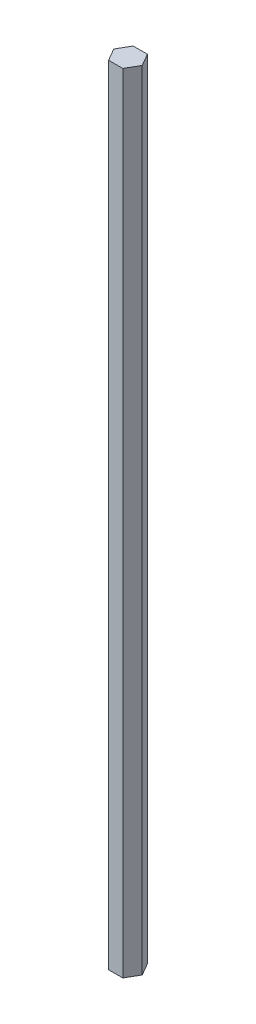
ISO-10303-21;
HEADER;
FILE_DESCRIPTION(('STEP AP214'),'2;1');
FILE_NAME('part.step','',(''),(''),'','','');
FILE_SCHEMA(('AUTOMOTIVE_DESIGN { 1 0 10303 214 1 1 1 1 }'));
ENDSEC;
DATA;
#1=APPLICATION_CONTEXT('core data for automotive mechanical design processes');
#2=APPLICATION_PROTOCOL_DEFINITION('international standard','automotive_design',2000,#1);
#3=PRODUCT_CONTEXT('',#1,'mechanical');
#4=PRODUCT('Part','Part','',(#3));
#5=PRODUCT_RELATED_PRODUCT_CATEGORY('part','',(#4));
#6=PRODUCT_DEFINITION_FORMATION('','',#4);
#7=PRODUCT_DEFINITION_CONTEXT('part definition',#1,'design');
#8=PRODUCT_DEFINITION('design','',#6,#7);
#9=PRODUCT_DEFINITION_SHAPE('','',#8);
#10=(LENGTH_UNIT() NAMED_UNIT(*) SI_UNIT(.MILLI.,.METRE.));
#11=(NAMED_UNIT(*) PLANE_ANGLE_UNIT() SI_UNIT($,.RADIAN.));
#12=(NAMED_UNIT(*) SI_UNIT($,.STERADIAN.) SOLID_ANGLE_UNIT());
#13=UNCERTAINTY_MEASURE_WITH_UNIT(LENGTH_MEASURE(1.E-05),#10,'distance_accuracy_value','');
#14=(GEOMETRIC_REPRESENTATION_CONTEXT(3) GLOBAL_UNCERTAINTY_ASSIGNED_CONTEXT((#13)) GLOBAL_UNIT_ASSIGNED_CONTEXT((#10,
#11,#12)) REPRESENTATION_CONTEXT('',''));
#15=CARTESIAN_POINT('',(0.,0.,0.));
#16=DIRECTION('',(0.,0.,1.));
#17=DIRECTION('',(1.,0.,0.));
#18=AXIS2_PLACEMENT_3D('',#15,#16,#17);
#19=CARTESIAN_POINT('',(3.6661742093542,406.4,6.34999999999996));
#20=DIRECTION('',(-0.866025403784442,0.,-0.499999999999995));
#21=DIRECTION('',(-0.499999999999995,0.,0.866025403784442));
#22=AXIS2_PLACEMENT_3D('',#19,#20,#21);
#23=PLANE('',#22);
#24=DIRECTION('',(0.499999999999995,0.,-0.866025403784442));
#25=VECTOR('',#24,1.);
#26=CARTESIAN_POINT('',(3.6661742093542,0.,6.34999999999996));
#27=LINE('',#26,#25);
#28=CARTESIAN_POINT('',(3.6661742093542,0.,6.34999999999996));
#29=VERTEX_POINT('',#28);
#30=CARTESIAN_POINT('',(7.33234841870825,0.,0.));
#31=VERTEX_POINT('',#30);
#32=EDGE_CURVE('E128',#29,#31,#27,.T.);
#33=ORIENTED_EDGE('',*,*,#32,.T.);
#34=DIRECTION('',(0.,-1.,0.));
#35=VECTOR('',#34,1.);
#36=CARTESIAN_POINT('',(7.33234841870825,406.4,0.));
#37=LINE('',#36,#35);
#38=CARTESIAN_POINT('',(7.33234841870825,406.4,0.));
#39=VERTEX_POINT('',#38);
#40=EDGE_CURVE('E11',#39,#31,#37,.T.);
#41=ORIENTED_EDGE('',*,*,#40,.F.);
#42=DIRECTION('',(0.499999999999995,0.,-0.866025403784442));
#43=VECTOR('',#42,1.);
#44=CARTESIAN_POINT('',(3.6661742093542,406.4,6.34999999999996));
#45=LINE('',#44,#43);
#46=CARTESIAN_POINT('',(3.6661742093542,406.4,6.34999999999996));
#47=VERTEX_POINT('',#46);
#48=EDGE_CURVE('E144',#47,#39,#45,.T.);
#49=ORIENTED_EDGE('',*,*,#48,.F.);
#50=DIRECTION('',(0.,-1.,0.));
#51=VECTOR('',#50,1.);
#52=CARTESIAN_POINT('',(3.6661742093542,406.4,6.34999999999996));
#53=LINE('',#52,#51);
#54=EDGE_CURVE('E124',#47,#29,#53,.T.);
#55=ORIENTED_EDGE('',*,*,#54,.T.);
#56=EDGE_LOOP('',(#33,#41,#49,#55));
#57=FACE_BOUND('',#56,.T.);
#58=ADVANCED_FACE('F39',(#57),#23,.F.);
#59=CARTESIAN_POINT('',(7.33234841870825,406.4,0.));
#60=DIRECTION('',(-0.866025403784438,0.,0.500000000000001));
#61=DIRECTION('',(0.500000000000001,0.,0.866025403784438));
#62=AXIS2_PLACEMENT_3D('',#59,#60,#61);
#63=PLANE('',#62);
#64=DIRECTION('',(-0.500000000000001,0.,-0.866025403784438));
#65=VECTOR('',#64,1.);
#66=CARTESIAN_POINT('',(7.33234841870825,0.,0.));
#67=LINE('',#66,#65);
#68=CARTESIAN_POINT('',(3.66617420935411,0.,-6.35000000000001));
#69=VERTEX_POINT('',#68);
#70=EDGE_CURVE('E132',#31,#69,#67,.T.);
#71=ORIENTED_EDGE('',*,*,#70,.T.);
#72=DIRECTION('',(0.,-1.,0.));
#73=VECTOR('',#72,1.);
#74=CARTESIAN_POINT('',(3.66617420935411,406.4,-6.35000000000001));
#75=LINE('',#74,#73);
#76=CARTESIAN_POINT('',(3.66617420935411,406.4,-6.35000000000001));
#77=VERTEX_POINT('',#76);
#78=EDGE_CURVE('E48',#77,#69,#75,.T.);
#79=ORIENTED_EDGE('',*,*,#78,.F.);
#80=DIRECTION('',(-0.500000000000001,0.,-0.866025403784438));
#81=VECTOR('',#80,1.);
#82=CARTESIAN_POINT('',(7.33234841870825,406.4,0.));
#83=LINE('',#82,#81);
#84=EDGE_CURVE('E93',#39,#77,#83,.T.);
#85=ORIENTED_EDGE('',*,*,#84,.F.);
#86=ORIENTED_EDGE('',*,*,#40,.T.);
#87=EDGE_LOOP('',(#71,#79,#85,#86));
#88=FACE_BOUND('',#87,.T.);
#89=ADVANCED_FACE('F172',(#88),#63,.F.);
#90=CARTESIAN_POINT('',(3.66617420935411,406.4,-6.35000000000001));
#91=DIRECTION('',(0.,0.,1.));
#92=DIRECTION('',(1.,0.,0.));
#93=AXIS2_PLACEMENT_3D('',#90,#91,#92);
#94=PLANE('',#93);
#95=DIRECTION('',(-1.,0.,0.));
#96=VECTOR('',#95,1.);
#97=CARTESIAN_POINT('',(3.66617420935411,0.,-6.35000000000001));
#98=LINE('',#97,#96);
#99=CARTESIAN_POINT('',(-3.66617420935416,0.,-6.34999999999999));
#100=VERTEX_POINT('',#99);
#101=EDGE_CURVE('E135',#69,#100,#98,.T.);
#102=ORIENTED_EDGE('',*,*,#101,.T.);
#103=DIRECTION('',(0.,-1.,0.));
#104=VECTOR('',#103,1.);
#105=CARTESIAN_POINT('',(-3.66617420935416,406.4,-6.34999999999999));
#106=LINE('',#105,#104);
#107=CARTESIAN_POINT('',(-3.66617420935416,406.4,-6.34999999999999));
#108=VERTEX_POINT('',#107);
#109=EDGE_CURVE('E117',#108,#100,#106,.T.);
#110=ORIENTED_EDGE('',*,*,#109,.F.);
#111=DIRECTION('',(-1.,0.,0.));
#112=VECTOR('',#111,1.);
#113=CARTESIAN_POINT('',(3.66617420935411,406.4,-6.35000000000001));
#114=LINE('',#113,#112);
#115=EDGE_CURVE('E106',#77,#108,#114,.T.);
#116=ORIENTED_EDGE('',*,*,#115,.F.);
#117=ORIENTED_EDGE('',*,*,#78,.T.);
#118=EDGE_LOOP('',(#102,#110,#116,#117));
#119=FACE_BOUND('',#118,.T.);
#120=ADVANCED_FACE('F154',(#119),#94,.F.);
#121=CARTESIAN_POINT('',(-3.66617420935416,406.4,-6.34999999999999));
#122=DIRECTION('',(0.866025403784441,0.,0.499999999999995));
#123=DIRECTION('',(0.499999999999995,0.,-0.866025403784441));
#124=AXIS2_PLACEMENT_3D('',#121,#122,#123);
#125=PLANE('',#124);
#126=DIRECTION('',(-0.499999999999995,0.,0.866025403784441));
#127=VECTOR('',#126,1.);
#128=CARTESIAN_POINT('',(-3.66617420935416,0.,-6.34999999999999));
#129=LINE('',#128,#127);
#130=CARTESIAN_POINT('',(-7.33234841870825,0.,0.));
#131=VERTEX_POINT('',#130);
#132=EDGE_CURVE('E115',#100,#131,#129,.T.);
#133=ORIENTED_EDGE('',*,*,#132,.T.);
#134=DIRECTION('',(0.,-1.,0.));
#135=VECTOR('',#134,1.);
#136=CARTESIAN_POINT('',(-7.33234841870825,406.4,0.));
#137=LINE('',#136,#135);
#138=CARTESIAN_POINT('',(-7.33234841870825,406.4,0.));
#139=VERTEX_POINT('',#138);
#140=EDGE_CURVE('E112',#139,#131,#137,.T.);
#141=ORIENTED_EDGE('',*,*,#140,.F.);
#142=DIRECTION('',(-0.499999999999995,0.,0.866025403784441));
#143=VECTOR('',#142,1.);
#144=CARTESIAN_POINT('',(-3.66617420935416,406.4,-6.34999999999999));
#145=LINE('',#144,#143);
#146=EDGE_CURVE('E100',#108,#139,#145,.T.);
#147=ORIENTED_EDGE('',*,*,#146,.F.);
#148=ORIENTED_EDGE('',*,*,#109,.T.);
#149=EDGE_LOOP('',(#133,#141,#147,#148));
#150=FACE_BOUND('',#149,.T.);
#151=ADVANCED_FACE('F113',(#150),#125,.F.);
#152=CARTESIAN_POINT('',(-7.33234841870825,406.4,0.));
#153=DIRECTION('',(0.866025403784435,0.,-0.500000000000007));
#154=DIRECTION('',(-0.500000000000007,0.,-0.866025403784435));
#155=AXIS2_PLACEMENT_3D('',#152,#153,#154);
#156=PLANE('',#155);
#157=DIRECTION('',(0.500000000000007,0.,0.866025403784435));
#158=VECTOR('',#157,1.);
#159=CARTESIAN_POINT('',(-7.33234841870825,0.,0.));
#160=LINE('',#159,#158);
#161=CARTESIAN_POINT('',(-3.66617420935407,0.,6.35000000000004));
#162=VERTEX_POINT('',#161);
#163=EDGE_CURVE('E79',#131,#162,#160,.T.);
#164=ORIENTED_EDGE('',*,*,#163,.T.);
#165=DIRECTION('',(0.,-1.,0.));
#166=VECTOR('',#165,1.);
#167=CARTESIAN_POINT('',(-3.66617420935407,406.4,6.35000000000004));
#168=LINE('',#167,#166);
#169=CARTESIAN_POINT('',(-3.66617420935407,406.4,6.35000000000004));
#170=VERTEX_POINT('',#169);
#171=EDGE_CURVE('E118',#170,#162,#168,.T.);
#172=ORIENTED_EDGE('',*,*,#171,.F.);
#173=DIRECTION('',(0.500000000000007,0.,0.866025403784435));
#174=VECTOR('',#173,1.);
#175=CARTESIAN_POINT('',(-7.33234841870825,406.4,0.));
#176=LINE('',#175,#174);
#177=EDGE_CURVE('E104',#139,#170,#176,.T.);
#178=ORIENTED_EDGE('',*,*,#177,.F.);
#179=ORIENTED_EDGE('',*,*,#140,.T.);
#180=EDGE_LOOP('',(#164,#172,#178,#179));
#181=FACE_BOUND('',#180,.T.);
#182=ADVANCED_FACE('F120',(#181),#156,.F.);
#183=CARTESIAN_POINT('',(-3.66617420935407,406.4,6.35000000000004));
#184=DIRECTION('',(0.,0.,-1.));
#185=DIRECTION('',(-1.,0.,0.));
#186=AXIS2_PLACEMENT_3D('',#183,#184,#185);
#187=PLANE('',#186);
#188=DIRECTION('',(1.,0.,0.));
#189=VECTOR('',#188,1.);
#190=CARTESIAN_POINT('',(-3.66617420935407,0.,6.35000000000004));
#191=LINE('',#190,#189);
#192=EDGE_CURVE('E85',#162,#29,#191,.T.);
#193=ORIENTED_EDGE('',*,*,#192,.T.);
#194=ORIENTED_EDGE('',*,*,#54,.F.);
#195=DIRECTION('',(1.,0.,0.));
#196=VECTOR('',#195,1.);
#197=CARTESIAN_POINT('',(-3.66617420935407,406.4,6.35000000000004));
#198=LINE('',#197,#196);
#199=EDGE_CURVE('E56',#170,#47,#198,.T.);
#200=ORIENTED_EDGE('',*,*,#199,.F.);
#201=ORIENTED_EDGE('',*,*,#171,.T.);
#202=EDGE_LOOP('',(#193,#194,#200,#201));
#203=FACE_BOUND('',#202,.T.);
#204=ADVANCED_FACE('F161',(#203),#187,.F.);
#205=CARTESIAN_POINT('',(0.,406.4,0.));
#206=DIRECTION('',(0.,1.,0.));
#207=DIRECTION('',(0.,0.,1.));
#208=AXIS2_PLACEMENT_3D('',#205,#206,#207);
#209=PLANE('',#208);
#210=ORIENTED_EDGE('',*,*,#48,.T.);
#211=ORIENTED_EDGE('',*,*,#84,.T.);
#212=ORIENTED_EDGE('',*,*,#115,.T.);
#213=ORIENTED_EDGE('',*,*,#146,.T.);
#214=ORIENTED_EDGE('',*,*,#177,.T.);
#215=ORIENTED_EDGE('',*,*,#199,.T.);
#216=EDGE_LOOP('',(#210,#211,#212,#213,#214,#215));
#217=FACE_BOUND('',#216,.T.);
#218=ADVANCED_FACE('F102',(#217),#209,.T.);
#219=CARTESIAN_POINT('',(0.,0.,0.));
#220=DIRECTION('',(0.,1.,0.));
#221=DIRECTION('',(0.,0.,1.));
#222=AXIS2_PLACEMENT_3D('',#219,#220,#221);
#223=PLANE('',#222);
#224=ORIENTED_EDGE('',*,*,#32,.F.);
#225=ORIENTED_EDGE('',*,*,#192,.F.);
#226=ORIENTED_EDGE('',*,*,#163,.F.);
#227=ORIENTED_EDGE('',*,*,#132,.F.);
#228=ORIENTED_EDGE('',*,*,#101,.F.);
#229=ORIENTED_EDGE('',*,*,#70,.F.);
#230=EDGE_LOOP('',(#224,#225,#226,#227,#228,#229));
#231=FACE_BOUND('',#230,.T.);
#232=ADVANCED_FACE('F157',(#231),#223,.F.);
#233=CLOSED_SHELL('',(#58,#89,#120,#151,#182,#204,#218,#232));
#234=MANIFOLD_SOLID_BREP('B2',#233);
#235=ADVANCED_BREP_SHAPE_REPRESENTATION('',(#18,#234),#14);
#236=SHAPE_DEFINITION_REPRESENTATION(#9,#235);
ENDSEC;
END-ISO-10303-21;
